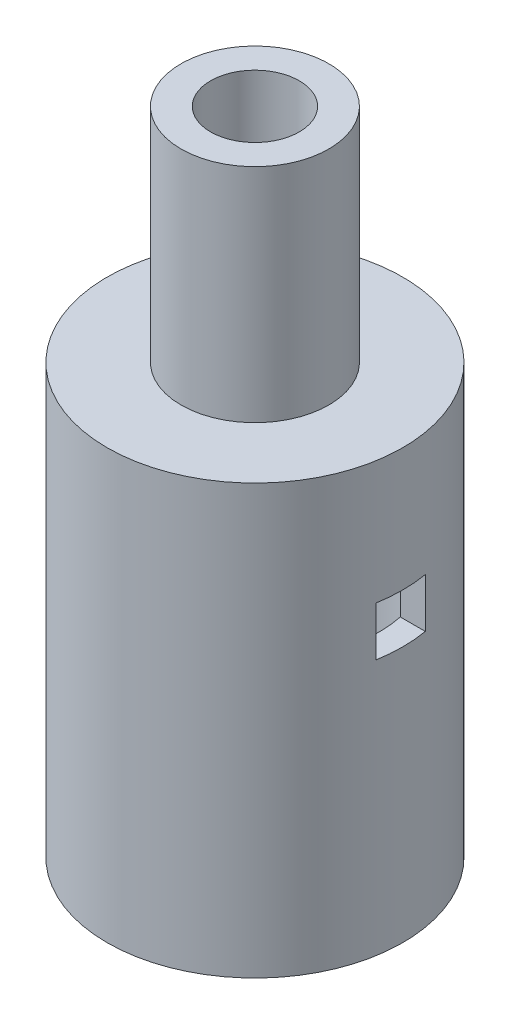
ISO-10303-21;
HEADER;
FILE_DESCRIPTION(('STEP AP214'),'2;1');
FILE_NAME('part.step','',(''),(''),'','','');
FILE_SCHEMA(('AUTOMOTIVE_DESIGN { 1 0 10303 214 1 1 1 1 }'));
ENDSEC;
DATA;
#1=APPLICATION_CONTEXT('core data for automotive mechanical design processes');
#2=APPLICATION_PROTOCOL_DEFINITION('international standard','automotive_design',2000,#1);
#3=PRODUCT_CONTEXT('',#1,'mechanical');
#4=PRODUCT('Part','Part','',(#3));
#5=PRODUCT_RELATED_PRODUCT_CATEGORY('part','',(#4));
#6=PRODUCT_DEFINITION_FORMATION('','',#4);
#7=PRODUCT_DEFINITION_CONTEXT('part definition',#1,'design');
#8=PRODUCT_DEFINITION('design','',#6,#7);
#9=PRODUCT_DEFINITION_SHAPE('','',#8);
#10=(LENGTH_UNIT() NAMED_UNIT(*) SI_UNIT(.MILLI.,.METRE.));
#11=(NAMED_UNIT(*) PLANE_ANGLE_UNIT() SI_UNIT($,.RADIAN.));
#12=(NAMED_UNIT(*) SI_UNIT($,.STERADIAN.) SOLID_ANGLE_UNIT());
#13=UNCERTAINTY_MEASURE_WITH_UNIT(LENGTH_MEASURE(1.E-05),#10,'distance_accuracy_value','');
#14=(GEOMETRIC_REPRESENTATION_CONTEXT(3) GLOBAL_UNCERTAINTY_ASSIGNED_CONTEXT((#13)) GLOBAL_UNIT_ASSIGNED_CONTEXT((#10,
#11,#12)) REPRESENTATION_CONTEXT('',''));
#15=CARTESIAN_POINT('',(0.,0.,0.));
#16=DIRECTION('',(0.,0.,1.));
#17=DIRECTION('',(1.,0.,0.));
#18=AXIS2_PLACEMENT_3D('',#15,#16,#17);
#19=CARTESIAN_POINT('',(0.,-22.098,0.));
#20=DIRECTION('',(0.,1.,0.));
#21=DIRECTION('',(0.,0.,1.));
#22=AXIS2_PLACEMENT_3D('',#19,#20,#21);
#23=CYLINDRICAL_SURFACE('',#22,7.62);
#24=CARTESIAN_POINT('',(0.,-6.35,0.));
#25=DIRECTION('',(0.,1.,0.));
#26=DIRECTION('',(0.,0.,1.));
#27=AXIS2_PLACEMENT_3D('',#24,#25,#26);
#28=CIRCLE('',#27,7.62);
#29=CARTESIAN_POINT('',(-7.51342132453651,-6.35,1.27));
#30=VERTEX_POINT('',#29);
#31=CARTESIAN_POINT('',(-7.51342132453651,-6.35,-1.27));
#32=VERTEX_POINT('',#31);
#33=EDGE_CURVE('E117',#30,#32,#28,.F.);
#34=ORIENTED_EDGE('',*,*,#33,.F.);
#35=DIRECTION('',(0.,1.,0.));
#36=VECTOR('',#35,1.);
#37=CARTESIAN_POINT('',(-7.51342132453651,-22.098,1.27));
#38=LINE('',#37,#36);
#39=CARTESIAN_POINT('',(-7.51342132453651,-8.89,1.27));
#40=VERTEX_POINT('',#39);
#41=EDGE_CURVE('E110',#40,#30,#38,.T.);
#42=ORIENTED_EDGE('',*,*,#41,.F.);
#43=CARTESIAN_POINT('',(0.,-8.89,0.));
#44=DIRECTION('',(0.,-1.,0.));
#45=DIRECTION('',(0.,0.,-1.));
#46=AXIS2_PLACEMENT_3D('',#43,#44,#45);
#47=CIRCLE('',#46,7.62);
#48=CARTESIAN_POINT('',(-7.51342132453651,-8.89,-1.27));
#49=VERTEX_POINT('',#48);
#50=EDGE_CURVE('E138',#49,#40,#47,.F.);
#51=ORIENTED_EDGE('',*,*,#50,.F.);
#52=DIRECTION('',(0.,1.,0.));
#53=VECTOR('',#52,1.);
#54=CARTESIAN_POINT('',(-7.51342132453651,-22.098,-1.27));
#55=LINE('',#54,#53);
#56=EDGE_CURVE('E130',#32,#49,#55,.F.);
#57=ORIENTED_EDGE('',*,*,#56,.F.);
#58=EDGE_LOOP('',(#34,#42,#51,#57));
#59=FACE_BOUND('',#58,.T.);
#60=CARTESIAN_POINT('',(7.51342132453651,-6.35,-1.27));
#61=VERTEX_POINT('',#60);
#62=CARTESIAN_POINT('',(7.51342132453651,-6.35,1.27));
#63=VERTEX_POINT('',#62);
#64=EDGE_CURVE('E129',#61,#63,#28,.F.);
#65=ORIENTED_EDGE('',*,*,#64,.F.);
#66=DIRECTION('',(0.,1.,0.));
#67=VECTOR('',#66,1.);
#68=CARTESIAN_POINT('',(7.51342132453651,-22.098,-1.27));
#69=LINE('',#68,#67);
#70=CARTESIAN_POINT('',(7.51342132453651,-8.89,-1.27));
#71=VERTEX_POINT('',#70);
#72=EDGE_CURVE('E136',#71,#61,#69,.T.);
#73=ORIENTED_EDGE('',*,*,#72,.F.);
#74=CARTESIAN_POINT('',(7.51342132453651,-8.89,1.27));
#75=VERTEX_POINT('',#74);
#76=EDGE_CURVE('E131',#75,#71,#47,.F.);
#77=ORIENTED_EDGE('',*,*,#76,.F.);
#78=DIRECTION('',(0.,1.,0.));
#79=VECTOR('',#78,1.);
#80=CARTESIAN_POINT('',(7.51342132453651,-22.098,1.27));
#81=LINE('',#80,#79);
#82=EDGE_CURVE('E120',#63,#75,#81,.F.);
#83=ORIENTED_EDGE('',*,*,#82,.F.);
#84=EDGE_LOOP('',(#65,#73,#77,#83));
#85=FACE_BOUND('',#84,.T.);
#86=CARTESIAN_POINT('',(0.,-22.098,0.));
#87=DIRECTION('',(0.,1.,0.));
#88=DIRECTION('',(0.,0.,1.));
#89=AXIS2_PLACEMENT_3D('',#86,#87,#88);
#90=CIRCLE('',#89,7.62);
#91=CARTESIAN_POINT('',(0.,-22.098,7.62));
#92=VERTEX_POINT('',#91);
#93=EDGE_CURVE('E163',#92,#92,#90,.T.);
#94=ORIENTED_EDGE('',*,*,#93,.T.);
#95=EDGE_LOOP('',(#94));
#96=FACE_BOUND('',#95,.T.);
#97=CARTESIAN_POINT('',(0.,0.,0.));
#98=DIRECTION('',(0.,1.,0.));
#99=DIRECTION('',(0.,0.,1.));
#100=AXIS2_PLACEMENT_3D('',#97,#98,#99);
#101=CIRCLE('',#100,7.62);
#102=CARTESIAN_POINT('',(0.,0.,7.62));
#103=VERTEX_POINT('',#102);
#104=EDGE_CURVE('E166',#103,#103,#101,.T.);
#105=ORIENTED_EDGE('',*,*,#104,.F.);
#106=EDGE_LOOP('',(#105));
#107=FACE_BOUND('',#106,.T.);
#108=ADVANCED_FACE('F45',(#59,#85,#96,#107),#23,.T.);
#109=CARTESIAN_POINT('',(0.,-22.098,0.));
#110=DIRECTION('',(0.,1.,0.));
#111=DIRECTION('',(0.,0.,1.));
#112=AXIS2_PLACEMENT_3D('',#109,#110,#111);
#113=PLANE('',#112);
#114=CARTESIAN_POINT('',(0.,-22.098,0.));
#115=DIRECTION('',(0.,-1.,0.));
#116=DIRECTION('',(0.,0.,-1.));
#117=AXIS2_PLACEMENT_3D('',#114,#115,#116);
#118=CIRCLE('',#117,6.35);
#119=CARTESIAN_POINT('',(0.,-22.098,-6.35));
#120=VERTEX_POINT('',#119);
#121=EDGE_CURVE('E169',#120,#120,#118,.T.);
#122=ORIENTED_EDGE('',*,*,#121,.F.);
#123=EDGE_LOOP('',(#122));
#124=FACE_BOUND('',#123,.T.);
#125=ORIENTED_EDGE('',*,*,#93,.F.);
#126=EDGE_LOOP('',(#125));
#127=FACE_BOUND('',#126,.T.);
#128=ADVANCED_FACE('F233',(#124,#127),#113,.F.);
#129=CARTESIAN_POINT('',(0.,0.,0.));
#130=DIRECTION('',(0.,1.,0.));
#131=DIRECTION('',(0.,0.,1.));
#132=AXIS2_PLACEMENT_3D('',#129,#130,#131);
#133=PLANE('',#132);
#134=CARTESIAN_POINT('',(0.,0.,0.));
#135=DIRECTION('',(0.,1.,0.));
#136=DIRECTION('',(0.,0.,1.));
#137=AXIS2_PLACEMENT_3D('',#134,#135,#136);
#138=CIRCLE('',#137,3.81);
#139=CARTESIAN_POINT('',(0.,0.,3.81));
#140=VERTEX_POINT('',#139);
#141=EDGE_CURVE('E159',#140,#140,#138,.T.);
#142=ORIENTED_EDGE('',*,*,#141,.F.);
#143=EDGE_LOOP('',(#142));
#144=FACE_BOUND('',#143,.T.);
#145=ORIENTED_EDGE('',*,*,#104,.T.);
#146=EDGE_LOOP('',(#145));
#147=FACE_BOUND('',#146,.T.);
#148=ADVANCED_FACE('F240',(#144,#147),#133,.T.);
#149=CARTESIAN_POINT('',(0.,-5.33400000000001,0.));
#150=DIRECTION('',(0.,-1.,0.));
#151=DIRECTION('',(0.,0.,-1.));
#152=AXIS2_PLACEMENT_3D('',#149,#150,#151);
#153=CYLINDRICAL_SURFACE('',#152,6.35);
#154=CARTESIAN_POINT('',(0.,-6.35,0.));
#155=DIRECTION('',(0.,1.,0.));
#156=DIRECTION('',(0.,0.,1.));
#157=AXIS2_PLACEMENT_3D('',#154,#155,#156);
#158=CIRCLE('',#157,6.35);
#159=CARTESIAN_POINT('',(-6.22170394666927,-6.35,1.27));
#160=VERTEX_POINT('',#159);
#161=CARTESIAN_POINT('',(-6.22170394666927,-6.35,-1.27));
#162=VERTEX_POINT('',#161);
#163=EDGE_CURVE('E125',#160,#162,#158,.F.);
#164=ORIENTED_EDGE('',*,*,#163,.T.);
#165=DIRECTION('',(0.,-1.,0.));
#166=VECTOR('',#165,1.);
#167=CARTESIAN_POINT('',(-6.22170394666927,-5.33400000000001,-1.27));
#168=LINE('',#167,#166);
#169=CARTESIAN_POINT('',(-6.22170394666927,-8.89,-1.27));
#170=VERTEX_POINT('',#169);
#171=EDGE_CURVE('E11',#162,#170,#168,.T.);
#172=ORIENTED_EDGE('',*,*,#171,.T.);
#173=CARTESIAN_POINT('',(0.,-8.89,0.));
#174=DIRECTION('',(0.,-1.,0.));
#175=DIRECTION('',(0.,0.,-1.));
#176=AXIS2_PLACEMENT_3D('',#173,#174,#175);
#177=CIRCLE('',#176,6.35);
#178=CARTESIAN_POINT('',(-6.22170394666927,-8.89,1.27));
#179=VERTEX_POINT('',#178);
#180=EDGE_CURVE('E47',#170,#179,#177,.F.);
#181=ORIENTED_EDGE('',*,*,#180,.T.);
#182=DIRECTION('',(0.,-1.,0.));
#183=VECTOR('',#182,1.);
#184=CARTESIAN_POINT('',(-6.22170394666927,-5.33400000000001,1.27));
#185=LINE('',#184,#183);
#186=EDGE_CURVE('E189',#179,#160,#185,.F.);
#187=ORIENTED_EDGE('',*,*,#186,.T.);
#188=EDGE_LOOP('',(#164,#172,#181,#187));
#189=FACE_BOUND('',#188,.T.);
#190=CARTESIAN_POINT('',(6.22170394666927,-8.89,1.27));
#191=VERTEX_POINT('',#190);
#192=CARTESIAN_POINT('',(6.22170394666927,-8.89,-1.27));
#193=VERTEX_POINT('',#192);
#194=EDGE_CURVE('E182',#191,#193,#177,.F.);
#195=ORIENTED_EDGE('',*,*,#194,.T.);
#196=DIRECTION('',(0.,-1.,0.));
#197=VECTOR('',#196,1.);
#198=CARTESIAN_POINT('',(6.22170394666927,-5.33400000000001,-1.27));
#199=LINE('',#198,#197);
#200=CARTESIAN_POINT('',(6.22170394666927,-6.35,-1.27));
#201=VERTEX_POINT('',#200);
#202=EDGE_CURVE('E187',#193,#201,#199,.F.);
#203=ORIENTED_EDGE('',*,*,#202,.T.);
#204=CARTESIAN_POINT('',(6.22170394666927,-6.35,1.27));
#205=VERTEX_POINT('',#204);
#206=EDGE_CURVE('E158',#201,#205,#158,.F.);
#207=ORIENTED_EDGE('',*,*,#206,.T.);
#208=DIRECTION('',(0.,-1.,0.));
#209=VECTOR('',#208,1.);
#210=CARTESIAN_POINT('',(6.22170394666927,-5.33400000000001,1.27));
#211=LINE('',#210,#209);
#212=EDGE_CURVE('E179',#205,#191,#211,.T.);
#213=ORIENTED_EDGE('',*,*,#212,.T.);
#214=EDGE_LOOP('',(#195,#203,#207,#213));
#215=FACE_BOUND('',#214,.T.);
#216=CARTESIAN_POINT('',(0.,-5.33400000000001,0.));
#217=DIRECTION('',(0.,-1.,0.));
#218=DIRECTION('',(0.,0.,-1.));
#219=AXIS2_PLACEMENT_3D('',#216,#217,#218);
#220=CIRCLE('',#219,6.35);
#221=CARTESIAN_POINT('',(0.,-5.33400000000001,-6.35));
#222=VERTEX_POINT('',#221);
#223=EDGE_CURVE('E164',#222,#222,#220,.T.);
#224=ORIENTED_EDGE('',*,*,#223,.F.);
#225=EDGE_LOOP('',(#224));
#226=FACE_BOUND('',#225,.T.);
#227=ORIENTED_EDGE('',*,*,#121,.T.);
#228=EDGE_LOOP('',(#227));
#229=FACE_BOUND('',#228,.T.);
#230=ADVANCED_FACE('F192',(#189,#215,#226,#229),#153,.F.);
#231=CARTESIAN_POINT('',(0.,-5.33400000000001,0.));
#232=DIRECTION('',(0.,-1.,0.));
#233=DIRECTION('',(0.,0.,-1.));
#234=AXIS2_PLACEMENT_3D('',#231,#232,#233);
#235=PLANE('',#234);
#236=CARTESIAN_POINT('',(0.,-5.33400000000001,0.));
#237=DIRECTION('',(0.,-1.,0.));
#238=DIRECTION('',(0.,0.,-1.));
#239=AXIS2_PLACEMENT_3D('',#236,#237,#238);
#240=CIRCLE('',#239,2.3495);
#241=CARTESIAN_POINT('',(0.,-5.33400000000001,-2.3495));
#242=VERTEX_POINT('',#241);
#243=EDGE_CURVE('E165',#242,#242,#240,.T.);
#244=ORIENTED_EDGE('',*,*,#243,.F.);
#245=EDGE_LOOP('',(#244));
#246=FACE_BOUND('',#245,.T.);
#247=ORIENTED_EDGE('',*,*,#223,.T.);
#248=EDGE_LOOP('',(#247));
#249=FACE_BOUND('',#248,.T.);
#250=ADVANCED_FACE('F248',(#246,#249),#235,.T.);
#251=CARTESIAN_POINT('',(0.,-22.098,0.));
#252=DIRECTION('',(0.,1.,0.));
#253=DIRECTION('',(0.,0.,1.));
#254=AXIS2_PLACEMENT_3D('',#251,#252,#253);
#255=CYLINDRICAL_SURFACE('',#254,2.3495);
#256=CARTESIAN_POINT('',(0.,0.,0.));
#257=DIRECTION('',(0.,1.,0.));
#258=DIRECTION('',(0.,0.,1.));
#259=AXIS2_PLACEMENT_3D('',#256,#257,#258);
#260=CIRCLE('',#259,2.3495);
#261=CARTESIAN_POINT('',(0.,0.,2.3495));
#262=VERTEX_POINT('',#261);
#263=EDGE_CURVE('E157',#262,#262,#260,.T.);
#264=ORIENTED_EDGE('',*,*,#263,.T.);
#265=EDGE_LOOP('',(#264));
#266=FACE_BOUND('',#265,.T.);
#267=ORIENTED_EDGE('',*,*,#243,.T.);
#268=EDGE_LOOP('',(#267));
#269=FACE_BOUND('',#268,.T.);
#270=ADVANCED_FACE('F252',(#266,#269),#255,.F.);
#271=CARTESIAN_POINT('',(0.,11.43,0.));
#272=DIRECTION('',(0.,1.,0.));
#273=DIRECTION('',(0.,0.,1.));
#274=AXIS2_PLACEMENT_3D('',#271,#272,#273);
#275=PLANE('',#274);
#276=CARTESIAN_POINT('',(0.,11.43,0.));
#277=DIRECTION('',(0.,1.,0.));
#278=DIRECTION('',(0.,0.,1.));
#279=AXIS2_PLACEMENT_3D('',#276,#277,#278);
#280=CIRCLE('',#279,2.286);
#281=CARTESIAN_POINT('',(0.,11.43,2.286));
#282=VERTEX_POINT('',#281);
#283=EDGE_CURVE('E143',#282,#282,#280,.T.);
#284=ORIENTED_EDGE('',*,*,#283,.F.);
#285=EDGE_LOOP('',(#284));
#286=FACE_BOUND('',#285,.T.);
#287=CARTESIAN_POINT('',(0.,11.43,0.));
#288=DIRECTION('',(0.,1.,0.));
#289=DIRECTION('',(0.,0.,1.));
#290=AXIS2_PLACEMENT_3D('',#287,#288,#289);
#291=CIRCLE('',#290,3.81);
#292=CARTESIAN_POINT('',(0.,11.43,3.81));
#293=VERTEX_POINT('',#292);
#294=EDGE_CURVE('E153',#293,#293,#291,.T.);
#295=ORIENTED_EDGE('',*,*,#294,.T.);
#296=EDGE_LOOP('',(#295));
#297=FACE_BOUND('',#296,.T.);
#298=ADVANCED_FACE('F253',(#286,#297),#275,.T.);
#299=CARTESIAN_POINT('',(0.,11.43,0.));
#300=DIRECTION('',(0.,-1.,0.));
#301=DIRECTION('',(0.,0.,-1.));
#302=AXIS2_PLACEMENT_3D('',#299,#300,#301);
#303=CYLINDRICAL_SURFACE('',#302,3.81);
#304=ORIENTED_EDGE('',*,*,#294,.F.);
#305=EDGE_LOOP('',(#304));
#306=FACE_BOUND('',#305,.T.);
#307=ORIENTED_EDGE('',*,*,#141,.T.);
#308=EDGE_LOOP('',(#307));
#309=FACE_BOUND('',#308,.T.);
#310=ADVANCED_FACE('F260',(#306,#309),#303,.T.);
#311=CARTESIAN_POINT('',(0.,0.,0.));
#312=DIRECTION('',(0.,1.,0.));
#313=DIRECTION('',(0.,0.,1.));
#314=AXIS2_PLACEMENT_3D('',#311,#312,#313);
#315=PLANE('',#314);
#316=CARTESIAN_POINT('',(0.,0.,0.));
#317=DIRECTION('',(0.,-1.,0.));
#318=DIRECTION('',(0.,0.,-1.));
#319=AXIS2_PLACEMENT_3D('',#316,#317,#318);
#320=CIRCLE('',#319,1.7198336091763);
#321=CARTESIAN_POINT('',(0.,0.,-1.7198336091763));
#322=VERTEX_POINT('',#321);
#323=EDGE_CURVE('E145',#322,#322,#320,.T.);
#324=ORIENTED_EDGE('',*,*,#323,.F.);
#325=EDGE_LOOP('',(#324));
#326=FACE_BOUND('',#325,.T.);
#327=ORIENTED_EDGE('',*,*,#263,.F.);
#328=EDGE_LOOP('',(#327));
#329=FACE_BOUND('',#328,.T.);
#330=ADVANCED_FACE('F258',(#326,#329),#315,.F.);
#331=CARTESIAN_POINT('',(0.,0.253999999999994,0.));
#332=DIRECTION('',(0.,1.,0.));
#333=DIRECTION('',(0.,0.,1.));
#334=AXIS2_PLACEMENT_3D('',#331,#332,#333);
#335=CYLINDRICAL_SURFACE('',#334,2.286);
#336=CARTESIAN_POINT('',(0.,0.253999999999994,0.));
#337=DIRECTION('',(0.,1.,0.));
#338=DIRECTION('',(0.,0.,1.));
#339=AXIS2_PLACEMENT_3D('',#336,#337,#338);
#340=CIRCLE('',#339,2.286);
#341=CARTESIAN_POINT('',(0.,0.253999999999994,2.286));
#342=VERTEX_POINT('',#341);
#343=EDGE_CURVE('E149',#342,#342,#340,.T.);
#344=ORIENTED_EDGE('',*,*,#343,.F.);
#345=EDGE_LOOP('',(#344));
#346=FACE_BOUND('',#345,.T.);
#347=ORIENTED_EDGE('',*,*,#283,.T.);
#348=EDGE_LOOP('',(#347));
#349=FACE_BOUND('',#348,.T.);
#350=ADVANCED_FACE('F265',(#346,#349),#335,.F.);
#351=CARTESIAN_POINT('',(0.,0.253999999999994,0.));
#352=DIRECTION('',(0.,1.,0.));
#353=DIRECTION('',(0.,0.,1.));
#354=AXIS2_PLACEMENT_3D('',#351,#352,#353);
#355=PLANE('',#354);
#356=CARTESIAN_POINT('',(0.,0.253999999999994,0.));
#357=DIRECTION('',(0.,1.,0.));
#358=DIRECTION('',(0.,0.,1.));
#359=AXIS2_PLACEMENT_3D('',#356,#357,#358);
#360=CIRCLE('',#359,1.7198336091763);
#361=CARTESIAN_POINT('',(0.,0.253999999999994,-1.7198336091763));
#362=VERTEX_POINT('',#361);
#363=EDGE_CURVE('E142',#362,#362,#360,.F.);
#364=ORIENTED_EDGE('',*,*,#363,.T.);
#365=EDGE_LOOP('',(#364));
#366=FACE_BOUND('',#365,.T.);
#367=ORIENTED_EDGE('',*,*,#343,.T.);
#368=EDGE_LOOP('',(#367));
#369=FACE_BOUND('',#368,.T.);
#370=ADVANCED_FACE('F272',(#366,#369),#355,.T.);
#371=CARTESIAN_POINT('',(0.,11.431,0.));
#372=DIRECTION('',(0.,-1.,0.));
#373=DIRECTION('',(0.,0.,-1.));
#374=AXIS2_PLACEMENT_3D('',#371,#372,#373);
#375=CYLINDRICAL_SURFACE('',#374,1.7198336091763);
#376=CARTESIAN_POINT('',(0.,0.253999999999994,-1.7198336091763));
#377=CARTESIAN_POINT('',(0.,0.251354166666661,-1.7198336091763));
#378=CARTESIAN_POINT('',(0.,0.248708333333328,-1.7198336091763));
#379=CARTESIAN_POINT('',(0.,0.243416666666661,-1.7198336091763));
#380=CARTESIAN_POINT('',(0.,0.240770833333327,-1.7198336091763));
#381=CARTESIAN_POINT('',(0.,0.23547916666666,-1.7198336091763));
#382=CARTESIAN_POINT('',(0.,0.232833333333327,-1.7198336091763));
#383=CARTESIAN_POINT('',(0.,0.227541666666661,-1.7198336091763));
#384=CARTESIAN_POINT('',(0.,0.224895833333328,-1.7198336091763));
#385=CARTESIAN_POINT('',(0.,0.219604166666661,-1.7198336091763));
#386=CARTESIAN_POINT('',(0.,0.216958333333328,-1.7198336091763));
#387=CARTESIAN_POINT('',(0.,0.211666666666661,-1.7198336091763));
#388=CARTESIAN_POINT('',(0.,0.209020833333328,-1.7198336091763));
#389=CARTESIAN_POINT('',(0.,0.203729166666662,-1.7198336091763));
#390=CARTESIAN_POINT('',(0.,0.201083333333329,-1.7198336091763));
#391=CARTESIAN_POINT('',(0.,0.195791666666662,-1.7198336091763));
#392=CARTESIAN_POINT('',(0.,0.193145833333329,-1.7198336091763));
#393=CARTESIAN_POINT('',(0.,0.187854166666663,-1.7198336091763));
#394=CARTESIAN_POINT('',(0.,0.185208333333329,-1.7198336091763));
#395=CARTESIAN_POINT('',(0.,0.179916666666662,-1.7198336091763));
#396=CARTESIAN_POINT('',(0.,0.177270833333329,-1.7198336091763));
#397=CARTESIAN_POINT('',(0.,0.171979166666663,-1.7198336091763));
#398=CARTESIAN_POINT('',(0.,0.16933333333333,-1.7198336091763));
#399=CARTESIAN_POINT('',(0.,0.164041666666663,-1.7198336091763));
#400=CARTESIAN_POINT('',(0.,0.161395833333329,-1.7198336091763));
#401=CARTESIAN_POINT('',(0.,0.156104166666663,-1.7198336091763));
#402=CARTESIAN_POINT('',(0.,0.15345833333333,-1.7198336091763));
#403=CARTESIAN_POINT('',(0.,0.148166666666663,-1.7198336091763));
#404=CARTESIAN_POINT('',(0.,0.14552083333333,-1.7198336091763));
#405=CARTESIAN_POINT('',(0.,0.140229166666664,-1.7198336091763));
#406=CARTESIAN_POINT('',(0.,0.13758333333333,-1.7198336091763));
#407=CARTESIAN_POINT('',(0.,0.132291666666663,-1.7198336091763));
#408=CARTESIAN_POINT('',(0.,0.12964583333333,-1.7198336091763));
#409=CARTESIAN_POINT('',(0.,0.124354166666664,-1.7198336091763));
#410=CARTESIAN_POINT('',(0.,0.121708333333331,-1.7198336091763));
#411=CARTESIAN_POINT('',(0.,0.116416666666664,-1.7198336091763));
#412=CARTESIAN_POINT('',(0.,0.11377083333333,-1.7198336091763));
#413=CARTESIAN_POINT('',(0.,0.108479166666664,-1.7198336091763));
#414=CARTESIAN_POINT('',(0.,0.10583333333333,-1.7198336091763));
#415=CARTESIAN_POINT('',(0.,0.100541666666664,-1.7198336091763));
#416=CARTESIAN_POINT('',(0.,0.0978958333333312,-1.7198336091763));
#417=CARTESIAN_POINT('',(0.,0.0926041666666644,-1.7198336091763));
#418=CARTESIAN_POINT('',(0.,0.0899583333333308,-1.7198336091763));
#419=CARTESIAN_POINT('',(0.,0.084666666666664,-1.7198336091763));
#420=CARTESIAN_POINT('',(0.,0.0820208333333309,-1.7198336091763));
#421=CARTESIAN_POINT('',(0.,0.0767291666666648,-1.7198336091763));
#422=CARTESIAN_POINT('',(0.,0.0740833333333317,-1.7198336091763));
#423=CARTESIAN_POINT('',(0.,0.0687916666666649,-1.7198336091763));
#424=CARTESIAN_POINT('',(0.,0.0661458333333313,-1.7198336091763));
#425=CARTESIAN_POINT('',(0.,0.0608541666666645,-1.7198336091763));
#426=CARTESIAN_POINT('',(0.,0.0582083333333314,-1.7198336091763));
#427=CARTESIAN_POINT('',(0.,0.0529166666666652,-1.7198336091763));
#428=CARTESIAN_POINT('',(0.,0.0502708333333321,-1.7198336091763));
#429=CARTESIAN_POINT('',(0.,0.044979166666666,-1.7198336091763));
#430=CARTESIAN_POINT('',(0.,0.0423333333333329,-1.7198336091763));
#431=CARTESIAN_POINT('',(0.,0.0370416666666661,-1.7198336091763));
#432=CARTESIAN_POINT('',(0.,0.0343958333333325,-1.7198336091763));
#433=CARTESIAN_POINT('',(0.,0.0291041666666657,-1.7198336091763));
#434=CARTESIAN_POINT('',(0.,0.0264583333333326,-1.7198336091763));
#435=CARTESIAN_POINT('',(0.,0.0211666666666664,-1.7198336091763));
#436=CARTESIAN_POINT('',(0.,0.0185208333333334,-1.7198336091763));
#437=CARTESIAN_POINT('',(0.,0.0132291666666666,-1.7198336091763));
#438=CARTESIAN_POINT('',(0.,0.0105833333333329,-1.7198336091763));
#439=CARTESIAN_POINT('',(0.,0.00529166666666618,-1.7198336091763));
#440=CARTESIAN_POINT('',(0.,0.00264583333333309,-1.7198336091763));
#441=CARTESIAN_POINT('',(0.,0.,-1.7198336091763));
#442=B_SPLINE_CURVE_WITH_KNOTS('',3,(#376,#377,#378,#379,#380,#381,#382,#383,#384,#385,#386,
#387,#388,#389,#390,#391,#392,#393,#394,#395,#396,#397,#398,#399,#400,#401,#402,#403,#404,#405,
#406,#407,#408,#409,#410,#411,#412,#413,#414,#415,#416,#417,#418,#419,#420,#421,#422,#423,#424,
#425,#426,#427,#428,#429,#430,#431,#432,#433,#434,#435,#436,#437,#438,#439,#440,#441),
.UNSPECIFIED.,.F.,.F.,(4,2,2,2,2,2,2,2,2,2,2,2,2,2,2,2,2,2,2,2,2,2,2,2,2,2,2,2,2,2,2,2,4),(0.,
0.00793749999999926,0.0158750000000003,0.0238124999999995,0.0317499999999988,0.0396874999999998,
0.0476249999999991,0.0555624999999983,0.0634999999999976,0.0714374999999986,0.0793749999999979,
0.0873124999999971,0.0952499999999981,0.103187499999997,0.111124999999997,0.119062499999998,
0.126999999999997,0.134937499999996,0.142874999999997,0.150812499999996,0.158749999999996,
0.166687499999997,0.174624999999996,0.182562499999995,0.190499999999996,0.198437499999995,
0.206374999999995,0.214312499999994,0.222249999999995,0.230187499999994,0.238124999999994,
0.246062499999995,0.253999999999994),.UNSPECIFIED.);
#443=EDGE_CURVE('BSEAM274',#362,#322,#442,.T.);
#444=ORIENTED_EDGE('',*,*,#363,.F.);
#445=ORIENTED_EDGE('',*,*,#323,.T.);
#446=ORIENTED_EDGE('',*,*,#443,.T.);
#447=ORIENTED_EDGE('',*,*,#443,.F.);
#448=EDGE_LOOP('',(#444,#446,#445,#447));
#449=FACE_BOUND('',#448,.T.);
#450=ADVANCED_FACE('F274',(#449),#375,.F.);
#451=CARTESIAN_POINT('',(-7.62,-6.35,1.27));
#452=DIRECTION('',(0.,1.,0.));
#453=DIRECTION('',(0.,0.,1.));
#454=AXIS2_PLACEMENT_3D('',#451,#452,#453);
#455=PLANE('',#454);
#456=ORIENTED_EDGE('',*,*,#64,.T.);
#457=DIRECTION('',(1.,0.,0.));
#458=VECTOR('',#457,1.);
#459=CARTESIAN_POINT('',(-7.62,-6.35,1.27));
#460=LINE('',#459,#458);
#461=EDGE_CURVE('E61',#205,#63,#460,.T.);
#462=ORIENTED_EDGE('',*,*,#461,.F.);
#463=ORIENTED_EDGE('',*,*,#206,.F.);
#464=DIRECTION('',(1.,0.,0.));
#465=VECTOR('',#464,1.);
#466=CARTESIAN_POINT('',(-7.62,-6.35,-1.27));
#467=LINE('',#466,#465);
#468=EDGE_CURVE('E134',#201,#61,#467,.T.);
#469=ORIENTED_EDGE('',*,*,#468,.T.);
#470=EDGE_LOOP('',(#456,#462,#463,#469));
#471=FACE_BOUND('',#470,.T.);
#472=ADVANCED_FACE('F206',(#471),#455,.F.);
#473=CARTESIAN_POINT('',(-7.62,-6.35,1.27));
#474=DIRECTION('',(0.,0.,1.));
#475=DIRECTION('',(0.,-1.,0.));
#476=AXIS2_PLACEMENT_3D('',#473,#474,#475);
#477=PLANE('',#476);
#478=ORIENTED_EDGE('',*,*,#82,.T.);
#479=DIRECTION('',(1.,0.,0.));
#480=VECTOR('',#479,1.);
#481=CARTESIAN_POINT('',(-7.62,-8.89,1.27));
#482=LINE('',#481,#480);
#483=EDGE_CURVE('E124',#191,#75,#482,.T.);
#484=ORIENTED_EDGE('',*,*,#483,.F.);
#485=ORIENTED_EDGE('',*,*,#212,.F.);
#486=ORIENTED_EDGE('',*,*,#461,.T.);
#487=EDGE_LOOP('',(#478,#484,#485,#486));
#488=FACE_BOUND('',#487,.T.);
#489=ADVANCED_FACE('F211',(#488),#477,.F.);
#490=CARTESIAN_POINT('',(-7.62,-8.89,1.27));
#491=DIRECTION('',(0.,-1.,0.));
#492=DIRECTION('',(0.,0.,-1.));
#493=AXIS2_PLACEMENT_3D('',#490,#491,#492);
#494=PLANE('',#493);
#495=ORIENTED_EDGE('',*,*,#76,.T.);
#496=DIRECTION('',(1.,0.,0.));
#497=VECTOR('',#496,1.);
#498=CARTESIAN_POINT('',(-7.62,-8.89,-1.27));
#499=LINE('',#498,#497);
#500=EDGE_CURVE('E197',#193,#71,#499,.T.);
#501=ORIENTED_EDGE('',*,*,#500,.F.);
#502=ORIENTED_EDGE('',*,*,#194,.F.);
#503=ORIENTED_EDGE('',*,*,#483,.T.);
#504=EDGE_LOOP('',(#495,#501,#502,#503));
#505=FACE_BOUND('',#504,.T.);
#506=ADVANCED_FACE('F218',(#505),#494,.F.);
#507=CARTESIAN_POINT('',(-7.62,-6.35,-1.27));
#508=DIRECTION('',(0.,0.,-1.));
#509=DIRECTION('',(0.,1.,0.));
#510=AXIS2_PLACEMENT_3D('',#507,#508,#509);
#511=PLANE('',#510);
#512=ORIENTED_EDGE('',*,*,#72,.T.);
#513=ORIENTED_EDGE('',*,*,#468,.F.);
#514=ORIENTED_EDGE('',*,*,#202,.F.);
#515=ORIENTED_EDGE('',*,*,#500,.T.);
#516=EDGE_LOOP('',(#512,#513,#514,#515));
#517=FACE_BOUND('',#516,.T.);
#518=ADVANCED_FACE('F220',(#517),#511,.F.);
#519=ORIENTED_EDGE('',*,*,#56,.T.);
#520=EDGE_CURVE('E128',#49,#170,#499,.T.);
#521=ORIENTED_EDGE('',*,*,#520,.T.);
#522=ORIENTED_EDGE('',*,*,#171,.F.);
#523=EDGE_CURVE('E57',#32,#162,#467,.T.);
#524=ORIENTED_EDGE('',*,*,#523,.F.);
#525=EDGE_LOOP('',(#519,#521,#522,#524));
#526=FACE_BOUND('',#525,.T.);
#527=ADVANCED_FACE('F193',(#526),#511,.F.);
#528=ORIENTED_EDGE('',*,*,#50,.T.);
#529=EDGE_CURVE('E113',#40,#179,#482,.T.);
#530=ORIENTED_EDGE('',*,*,#529,.T.);
#531=ORIENTED_EDGE('',*,*,#180,.F.);
#532=ORIENTED_EDGE('',*,*,#520,.F.);
#533=EDGE_LOOP('',(#528,#530,#531,#532));
#534=FACE_BOUND('',#533,.T.);
#535=ADVANCED_FACE('F228',(#534),#494,.F.);
#536=ORIENTED_EDGE('',*,*,#41,.T.);
#537=EDGE_CURVE('E109',#30,#160,#460,.T.);
#538=ORIENTED_EDGE('',*,*,#537,.T.);
#539=ORIENTED_EDGE('',*,*,#186,.F.);
#540=ORIENTED_EDGE('',*,*,#529,.F.);
#541=EDGE_LOOP('',(#536,#538,#539,#540));
#542=FACE_BOUND('',#541,.T.);
#543=ADVANCED_FACE('F107',(#542),#477,.F.);
#544=ORIENTED_EDGE('',*,*,#33,.T.);
#545=ORIENTED_EDGE('',*,*,#523,.T.);
#546=ORIENTED_EDGE('',*,*,#163,.F.);
#547=ORIENTED_EDGE('',*,*,#537,.F.);
#548=EDGE_LOOP('',(#544,#545,#546,#547));
#549=FACE_BOUND('',#548,.T.);
#550=ADVANCED_FACE('F119',(#549),#455,.F.);
#551=CLOSED_SHELL('',(#108,#128,#148,#230,#250,#270,#298,#310,#330,#350,#370,#450,#472,#489,
#506,#518,#527,#535,#543,#550));
#552=MANIFOLD_SOLID_BREP('B2',#551);
#553=ADVANCED_BREP_SHAPE_REPRESENTATION('',(#18,#552),#14);
#554=SHAPE_DEFINITION_REPRESENTATION(#9,#553);
ENDSEC;
END-ISO-10303-21;
